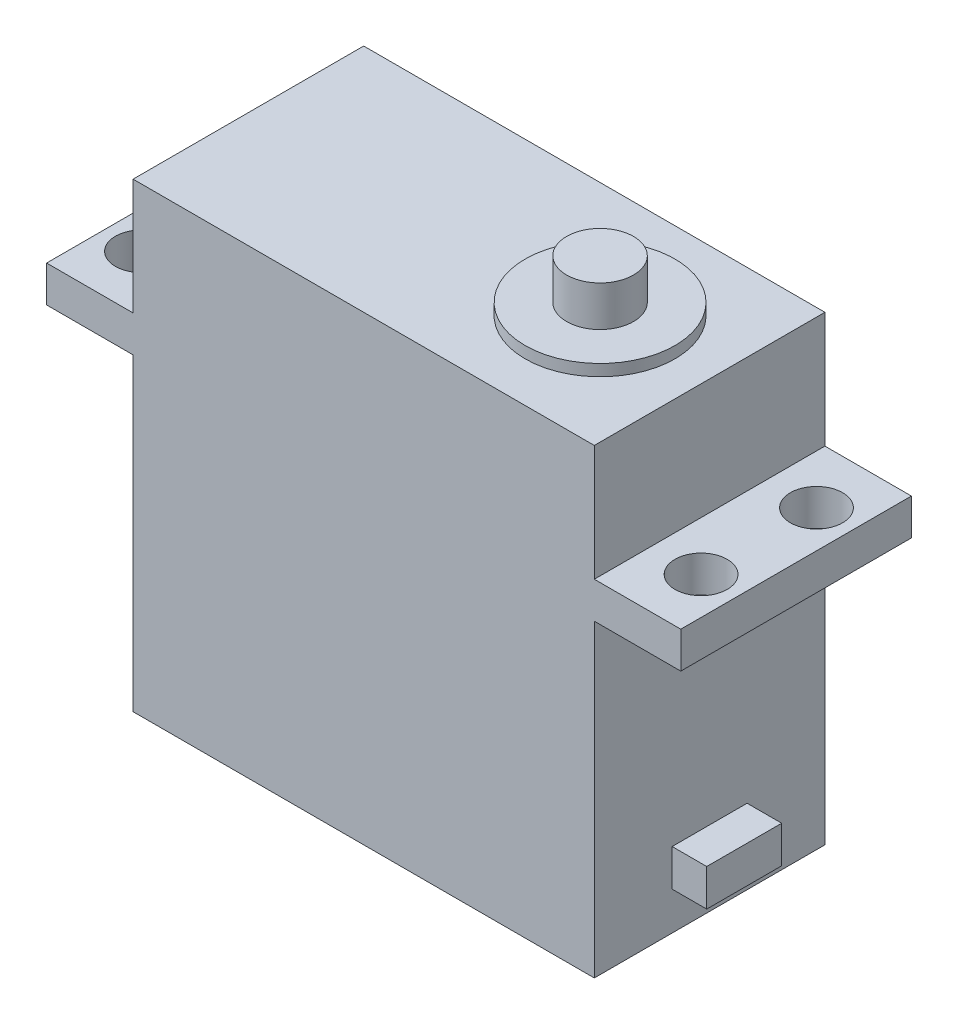
ISO-10303-21;
HEADER;
FILE_DESCRIPTION(('STEP AP214'),'2;1');
FILE_NAME('part.step','',(''),(''),'','','');
FILE_SCHEMA(('AUTOMOTIVE_DESIGN { 1 0 10303 214 1 1 1 1 }'));
ENDSEC;
DATA;
#1=APPLICATION_CONTEXT('core data for automotive mechanical design processes');
#2=APPLICATION_PROTOCOL_DEFINITION('international standard','automotive_design',2000,#1);
#3=PRODUCT_CONTEXT('',#1,'mechanical');
#4=PRODUCT('Part','Part','',(#3));
#5=PRODUCT_RELATED_PRODUCT_CATEGORY('part','',(#4));
#6=PRODUCT_DEFINITION_FORMATION('','',#4);
#7=PRODUCT_DEFINITION_CONTEXT('part definition',#1,'design');
#8=PRODUCT_DEFINITION('design','',#6,#7);
#9=PRODUCT_DEFINITION_SHAPE('','',#8);
#10=(LENGTH_UNIT() NAMED_UNIT(*) SI_UNIT(.MILLI.,.METRE.));
#11=(NAMED_UNIT(*) PLANE_ANGLE_UNIT() SI_UNIT($,.RADIAN.));
#12=(NAMED_UNIT(*) SI_UNIT($,.STERADIAN.) SOLID_ANGLE_UNIT());
#13=UNCERTAINTY_MEASURE_WITH_UNIT(LENGTH_MEASURE(1.E-05),#10,'distance_accuracy_value','');
#14=(GEOMETRIC_REPRESENTATION_CONTEXT(3) GLOBAL_UNCERTAINTY_ASSIGNED_CONTEXT((#13)) GLOBAL_UNIT_ASSIGNED_CONTEXT((#10,
#11,#12)) REPRESENTATION_CONTEXT('',''));
#15=CARTESIAN_POINT('',(0.,0.,0.));
#16=DIRECTION('',(0.,0.,1.));
#17=DIRECTION('',(1.,0.,0.));
#18=AXIS2_PLACEMENT_3D('',#15,#16,#17);
#19=CARTESIAN_POINT('',(20.,40.,-10.));
#20=DIRECTION('',(-1.,0.,0.));
#21=DIRECTION('',(0.,0.,1.));
#22=AXIS2_PLACEMENT_3D('',#19,#20,#21);
#23=PLANE('',#22);
#24=DIRECTION('',(0.,0.,-1.));
#25=VECTOR('',#24,1.);
#26=CARTESIAN_POINT('',(20.,26.8,-10.));
#27=LINE('',#26,#25);
#28=CARTESIAN_POINT('',(20.,26.8,10.));
#29=VERTEX_POINT('',#28);
#30=CARTESIAN_POINT('',(20.,26.8,-10.));
#31=VERTEX_POINT('',#30);
#32=EDGE_CURVE('E248',#29,#31,#27,.T.);
#33=ORIENTED_EDGE('',*,*,#32,.F.);
#34=DIRECTION('',(0.,-1.,0.));
#35=VECTOR('',#34,1.);
#36=CARTESIAN_POINT('',(20.,40.,10.));
#37=LINE('',#36,#35);
#38=CARTESIAN_POINT('',(20.,0.,10.));
#39=VERTEX_POINT('',#38);
#40=EDGE_CURVE('E266',#29,#39,#37,.T.);
#41=ORIENTED_EDGE('',*,*,#40,.T.);
#42=DIRECTION('',(0.,0.,-1.));
#43=VECTOR('',#42,1.);
#44=CARTESIAN_POINT('',(20.,0.,-10.));
#45=LINE('',#44,#43);
#46=CARTESIAN_POINT('',(20.,0.,-10.));
#47=VERTEX_POINT('',#46);
#48=EDGE_CURVE('E255',#39,#47,#45,.T.);
#49=ORIENTED_EDGE('',*,*,#48,.T.);
#50=DIRECTION('',(0.,-1.,0.));
#51=VECTOR('',#50,1.);
#52=CARTESIAN_POINT('',(20.,40.,-10.));
#53=LINE('',#52,#51);
#54=EDGE_CURVE('E286',#31,#47,#53,.T.);
#55=ORIENTED_EDGE('',*,*,#54,.F.);
#56=EDGE_LOOP('',(#33,#41,#49,#55));
#57=FACE_BOUND('',#56,.T.);
#58=DIRECTION('',(0.,1.,0.));
#59=VECTOR('',#58,1.);
#60=CARTESIAN_POINT('',(20.,6.5,-3.25));
#61=LINE('',#60,#59);
#62=CARTESIAN_POINT('',(20.,3.3,-3.25));
#63=VERTEX_POINT('',#62);
#64=CARTESIAN_POINT('',(20.,6.5,-3.25));
#65=VERTEX_POINT('',#64);
#66=EDGE_CURVE('E177',#63,#65,#61,.T.);
#67=ORIENTED_EDGE('',*,*,#66,.F.);
#68=DIRECTION('',(0.,0.,-1.));
#69=VECTOR('',#68,1.);
#70=CARTESIAN_POINT('',(20.,3.3,3.25));
#71=LINE('',#70,#69);
#72=CARTESIAN_POINT('',(20.,3.3,3.25));
#73=VERTEX_POINT('',#72);
#74=EDGE_CURVE('E174',#73,#63,#71,.T.);
#75=ORIENTED_EDGE('',*,*,#74,.F.);
#76=DIRECTION('',(0.,-1.,0.));
#77=VECTOR('',#76,1.);
#78=CARTESIAN_POINT('',(20.,6.5,3.25));
#79=LINE('',#78,#77);
#80=CARTESIAN_POINT('',(20.,6.5,3.25));
#81=VERTEX_POINT('',#80);
#82=EDGE_CURVE('E64',#81,#73,#79,.T.);
#83=ORIENTED_EDGE('',*,*,#82,.F.);
#84=DIRECTION('',(0.,0.,1.));
#85=VECTOR('',#84,1.);
#86=CARTESIAN_POINT('',(20.,6.5,3.25));
#87=LINE('',#86,#85);
#88=EDGE_CURVE('E59',#65,#81,#87,.T.);
#89=ORIENTED_EDGE('',*,*,#88,.F.);
#90=EDGE_LOOP('',(#67,#75,#83,#89));
#91=FACE_BOUND('',#90,.T.);
#92=ADVANCED_FACE('F42',(#57,#91),#23,.F.);
#93=CARTESIAN_POINT('',(-20.,40.,-10.));
#94=DIRECTION('',(1.,0.,0.));
#95=DIRECTION('',(0.,0.,-1.));
#96=AXIS2_PLACEMENT_3D('',#93,#94,#95);
#97=PLANE('',#96);
#98=DIRECTION('',(0.,0.,1.));
#99=VECTOR('',#98,1.);
#100=CARTESIAN_POINT('',(-20.,26.8,-10.));
#101=LINE('',#100,#99);
#102=CARTESIAN_POINT('',(-20.,26.8,-10.));
#103=VERTEX_POINT('',#102);
#104=CARTESIAN_POINT('',(-20.,26.8,10.));
#105=VERTEX_POINT('',#104);
#106=EDGE_CURVE('E245',#103,#105,#101,.T.);
#107=ORIENTED_EDGE('',*,*,#106,.F.);
#108=DIRECTION('',(0.,-1.,0.));
#109=VECTOR('',#108,1.);
#110=CARTESIAN_POINT('',(-20.,40.,-10.));
#111=LINE('',#110,#109);
#112=CARTESIAN_POINT('',(-20.,0.,-10.));
#113=VERTEX_POINT('',#112);
#114=EDGE_CURVE('E283',#103,#113,#111,.T.);
#115=ORIENTED_EDGE('',*,*,#114,.T.);
#116=DIRECTION('',(0.,0.,1.));
#117=VECTOR('',#116,1.);
#118=CARTESIAN_POINT('',(-20.,0.,-10.));
#119=LINE('',#118,#117);
#120=CARTESIAN_POINT('',(-20.,0.,10.));
#121=VERTEX_POINT('',#120);
#122=EDGE_CURVE('E272',#113,#121,#119,.T.);
#123=ORIENTED_EDGE('',*,*,#122,.T.);
#124=DIRECTION('',(0.,-1.,0.));
#125=VECTOR('',#124,1.);
#126=CARTESIAN_POINT('',(-20.,40.,10.));
#127=LINE('',#126,#125);
#128=EDGE_CURVE('E279',#105,#121,#127,.T.);
#129=ORIENTED_EDGE('',*,*,#128,.F.);
#130=EDGE_LOOP('',(#107,#115,#123,#129));
#131=FACE_BOUND('',#130,.T.);
#132=ADVANCED_FACE('F316',(#131),#97,.F.);
#133=CARTESIAN_POINT('',(20.,40.,10.));
#134=VERTEX_POINT('',#133);
#135=CARTESIAN_POINT('',(20.,29.95,10.));
#136=VERTEX_POINT('',#135);
#137=EDGE_CURVE('E277',#134,#136,#37,.T.);
#138=ORIENTED_EDGE('',*,*,#137,.T.);
#139=DIRECTION('',(0.,0.,-1.));
#140=VECTOR('',#139,1.);
#141=CARTESIAN_POINT('',(20.,29.95,-10.));
#142=LINE('',#141,#140);
#143=CARTESIAN_POINT('',(20.,29.95,-10.));
#144=VERTEX_POINT('',#143);
#145=EDGE_CURVE('E253',#136,#144,#142,.T.);
#146=ORIENTED_EDGE('',*,*,#145,.T.);
#147=CARTESIAN_POINT('',(20.,40.,-10.));
#148=VERTEX_POINT('',#147);
#149=EDGE_CURVE('E51',#148,#144,#53,.T.);
#150=ORIENTED_EDGE('',*,*,#149,.F.);
#151=DIRECTION('',(0.,0.,-1.));
#152=VECTOR('',#151,1.);
#153=CARTESIAN_POINT('',(20.,40.,-10.));
#154=LINE('',#153,#152);
#155=EDGE_CURVE('E256',#134,#148,#154,.T.);
#156=ORIENTED_EDGE('',*,*,#155,.F.);
#157=EDGE_LOOP('',(#138,#146,#150,#156));
#158=FACE_BOUND('',#157,.T.);
#159=ADVANCED_FACE('F44',(#158),#23,.F.);
#160=CARTESIAN_POINT('',(-20.,40.,-10.));
#161=DIRECTION('',(0.,0.,1.));
#162=DIRECTION('',(1.,0.,0.));
#163=AXIS2_PLACEMENT_3D('',#160,#161,#162);
#164=PLANE('',#163);
#165=ORIENTED_EDGE('',*,*,#149,.T.);
#166=DIRECTION('',(-1.,0.,0.));
#167=VECTOR('',#166,1.);
#168=CARTESIAN_POINT('',(-27.5,29.95,-10.));
#169=LINE('',#168,#167);
#170=CARTESIAN_POINT('',(27.5,29.95,-10.));
#171=VERTEX_POINT('',#170);
#172=EDGE_CURVE('E213',#171,#144,#169,.T.);
#173=ORIENTED_EDGE('',*,*,#172,.F.);
#174=DIRECTION('',(0.,-1.,0.));
#175=VECTOR('',#174,1.);
#176=CARTESIAN_POINT('',(27.5,29.95,-10.));
#177=LINE('',#176,#175);
#178=CARTESIAN_POINT('',(27.5,26.8,-10.));
#179=VERTEX_POINT('',#178);
#180=EDGE_CURVE('E242',#171,#179,#177,.T.);
#181=ORIENTED_EDGE('',*,*,#180,.T.);
#182=DIRECTION('',(-1.,0.,0.));
#183=VECTOR('',#182,1.);
#184=CARTESIAN_POINT('',(-27.5,26.8,-10.));
#185=LINE('',#184,#183);
#186=EDGE_CURVE('E226',#179,#31,#185,.T.);
#187=ORIENTED_EDGE('',*,*,#186,.T.);
#188=ORIENTED_EDGE('',*,*,#54,.T.);
#189=DIRECTION('',(-1.,0.,0.));
#190=VECTOR('',#189,1.);
#191=CARTESIAN_POINT('',(-20.,0.,-10.));
#192=LINE('',#191,#190);
#193=EDGE_CURVE('E269',#47,#113,#192,.T.);
#194=ORIENTED_EDGE('',*,*,#193,.T.);
#195=ORIENTED_EDGE('',*,*,#114,.F.);
#196=CARTESIAN_POINT('',(-27.5,26.8,-10.));
#197=VERTEX_POINT('',#196);
#198=EDGE_CURVE('E225',#103,#197,#185,.T.);
#199=ORIENTED_EDGE('',*,*,#198,.T.);
#200=DIRECTION('',(0.,-1.,0.));
#201=VECTOR('',#200,1.);
#202=CARTESIAN_POINT('',(-27.5,29.95,-10.));
#203=LINE('',#202,#201);
#204=CARTESIAN_POINT('',(-27.5,29.95,-10.));
#205=VERTEX_POINT('',#204);
#206=EDGE_CURVE('E239',#205,#197,#203,.T.);
#207=ORIENTED_EDGE('',*,*,#206,.F.);
#208=CARTESIAN_POINT('',(-20.,29.95,-10.));
#209=VERTEX_POINT('',#208);
#210=EDGE_CURVE('E211',#209,#205,#169,.T.);
#211=ORIENTED_EDGE('',*,*,#210,.F.);
#212=CARTESIAN_POINT('',(-20.,40.,-10.));
#213=VERTEX_POINT('',#212);
#214=EDGE_CURVE('E284',#213,#209,#111,.T.);
#215=ORIENTED_EDGE('',*,*,#214,.F.);
#216=DIRECTION('',(-1.,0.,0.));
#217=VECTOR('',#216,1.);
#218=CARTESIAN_POINT('',(-20.,40.,-10.));
#219=LINE('',#218,#217);
#220=EDGE_CURVE('E259',#148,#213,#219,.T.);
#221=ORIENTED_EDGE('',*,*,#220,.F.);
#222=EDGE_LOOP('',(#165,#173,#181,#187,#188,#194,#195,#199,#207,#211,#215,#221));
#223=FACE_BOUND('',#222,.T.);
#224=ADVANCED_FACE('F327',(#223),#164,.F.);
#225=ORIENTED_EDGE('',*,*,#214,.T.);
#226=DIRECTION('',(0.,0.,1.));
#227=VECTOR('',#226,1.);
#228=CARTESIAN_POINT('',(-20.,29.95,-10.));
#229=LINE('',#228,#227);
#230=CARTESIAN_POINT('',(-20.,29.95,10.));
#231=VERTEX_POINT('',#230);
#232=EDGE_CURVE('E251',#209,#231,#229,.T.);
#233=ORIENTED_EDGE('',*,*,#232,.T.);
#234=CARTESIAN_POINT('',(-20.,40.,10.));
#235=VERTEX_POINT('',#234);
#236=EDGE_CURVE('E280',#235,#231,#127,.T.);
#237=ORIENTED_EDGE('',*,*,#236,.F.);
#238=DIRECTION('',(0.,0.,1.));
#239=VECTOR('',#238,1.);
#240=CARTESIAN_POINT('',(-20.,40.,-10.));
#241=LINE('',#240,#239);
#242=EDGE_CURVE('E262',#213,#235,#241,.T.);
#243=ORIENTED_EDGE('',*,*,#242,.F.);
#244=EDGE_LOOP('',(#225,#233,#237,#243));
#245=FACE_BOUND('',#244,.T.);
#246=ADVANCED_FACE('F325',(#245),#97,.F.);
#247=CARTESIAN_POINT('',(-20.,40.,10.));
#248=DIRECTION('',(0.,0.,-1.));
#249=DIRECTION('',(-1.,0.,0.));
#250=AXIS2_PLACEMENT_3D('',#247,#248,#249);
#251=PLANE('',#250);
#252=ORIENTED_EDGE('',*,*,#236,.T.);
#253=DIRECTION('',(1.,0.,0.));
#254=VECTOR('',#253,1.);
#255=CARTESIAN_POINT('',(-27.5,29.95,10.));
#256=LINE('',#255,#254);
#257=CARTESIAN_POINT('',(-27.5,29.95,10.));
#258=VERTEX_POINT('',#257);
#259=EDGE_CURVE('E219',#258,#231,#256,.T.);
#260=ORIENTED_EDGE('',*,*,#259,.F.);
#261=DIRECTION('',(0.,-1.,0.));
#262=VECTOR('',#261,1.);
#263=CARTESIAN_POINT('',(-27.5,29.95,10.));
#264=LINE('',#263,#262);
#265=CARTESIAN_POINT('',(-27.5,26.8,10.));
#266=VERTEX_POINT('',#265);
#267=EDGE_CURVE('E236',#258,#266,#264,.T.);
#268=ORIENTED_EDGE('',*,*,#267,.T.);
#269=DIRECTION('',(1.,0.,0.));
#270=VECTOR('',#269,1.);
#271=CARTESIAN_POINT('',(-27.5,26.8,10.));
#272=LINE('',#271,#270);
#273=EDGE_CURVE('E212',#266,#105,#272,.T.);
#274=ORIENTED_EDGE('',*,*,#273,.T.);
#275=ORIENTED_EDGE('',*,*,#128,.T.);
#276=DIRECTION('',(1.,0.,0.));
#277=VECTOR('',#276,1.);
#278=CARTESIAN_POINT('',(-20.,0.,10.));
#279=LINE('',#278,#277);
#280=EDGE_CURVE('E260',#121,#39,#279,.T.);
#281=ORIENTED_EDGE('',*,*,#280,.T.);
#282=ORIENTED_EDGE('',*,*,#40,.F.);
#283=CARTESIAN_POINT('',(27.5,26.8,10.));
#284=VERTEX_POINT('',#283);
#285=EDGE_CURVE('E231',#29,#284,#272,.T.);
#286=ORIENTED_EDGE('',*,*,#285,.T.);
#287=DIRECTION('',(0.,-1.,0.));
#288=VECTOR('',#287,1.);
#289=CARTESIAN_POINT('',(27.5,29.95,10.));
#290=LINE('',#289,#288);
#291=CARTESIAN_POINT('',(27.5,29.95,10.));
#292=VERTEX_POINT('',#291);
#293=EDGE_CURVE('E222',#292,#284,#290,.T.);
#294=ORIENTED_EDGE('',*,*,#293,.F.);
#295=EDGE_CURVE('E218',#136,#292,#256,.T.);
#296=ORIENTED_EDGE('',*,*,#295,.F.);
#297=ORIENTED_EDGE('',*,*,#137,.F.);
#298=DIRECTION('',(1.,0.,0.));
#299=VECTOR('',#298,1.);
#300=CARTESIAN_POINT('',(-20.,40.,10.));
#301=LINE('',#300,#299);
#302=EDGE_CURVE('E264',#235,#134,#301,.T.);
#303=ORIENTED_EDGE('',*,*,#302,.F.);
#304=EDGE_LOOP('',(#252,#260,#268,#274,#275,#281,#282,#286,#294,#296,#297,#303));
#305=FACE_BOUND('',#304,.T.);
#306=ADVANCED_FACE('F343',(#305),#251,.F.);
#307=CARTESIAN_POINT('',(0.,40.,0.));
#308=DIRECTION('',(0.,1.,0.));
#309=DIRECTION('',(0.,0.,1.));
#310=AXIS2_PLACEMENT_3D('',#307,#308,#309);
#311=PLANE('',#310);
#312=CARTESIAN_POINT('',(10.5,40.,0.));
#313=DIRECTION('',(0.,1.,0.));
#314=DIRECTION('',(0.,0.,1.));
#315=AXIS2_PLACEMENT_3D('',#312,#313,#314);
#316=CIRCLE('',#315,6.5);
#317=CARTESIAN_POINT('',(10.5,40.,6.5));
#318=VERTEX_POINT('',#317);
#319=EDGE_CURVE('E181',#318,#318,#316,.T.);
#320=ORIENTED_EDGE('',*,*,#319,.F.);
#321=EDGE_LOOP('',(#320));
#322=FACE_BOUND('',#321,.T.);
#323=ORIENTED_EDGE('',*,*,#155,.T.);
#324=ORIENTED_EDGE('',*,*,#220,.T.);
#325=ORIENTED_EDGE('',*,*,#242,.T.);
#326=ORIENTED_EDGE('',*,*,#302,.T.);
#327=EDGE_LOOP('',(#323,#324,#325,#326));
#328=FACE_BOUND('',#327,.T.);
#329=ADVANCED_FACE('F355',(#322,#328),#311,.T.);
#330=CARTESIAN_POINT('',(0.,0.,0.));
#331=DIRECTION('',(0.,1.,0.));
#332=DIRECTION('',(0.,0.,1.));
#333=AXIS2_PLACEMENT_3D('',#330,#331,#332);
#334=PLANE('',#333);
#335=ORIENTED_EDGE('',*,*,#48,.F.);
#336=ORIENTED_EDGE('',*,*,#280,.F.);
#337=ORIENTED_EDGE('',*,*,#122,.F.);
#338=ORIENTED_EDGE('',*,*,#193,.F.);
#339=EDGE_LOOP('',(#335,#336,#337,#338));
#340=FACE_BOUND('',#339,.T.);
#341=ADVANCED_FACE('F376',(#340),#334,.F.);
#342=CARTESIAN_POINT('',(-27.5,29.95,-10.));
#343=DIRECTION('',(1.,0.,0.));
#344=DIRECTION('',(0.,0.,-1.));
#345=AXIS2_PLACEMENT_3D('',#342,#343,#344);
#346=PLANE('',#345);
#347=DIRECTION('',(0.,0.,1.));
#348=VECTOR('',#347,1.);
#349=CARTESIAN_POINT('',(-27.5,26.8,-10.));
#350=LINE('',#349,#348);
#351=EDGE_CURVE('E229',#197,#266,#350,.T.);
#352=ORIENTED_EDGE('',*,*,#351,.T.);
#353=ORIENTED_EDGE('',*,*,#267,.F.);
#354=DIRECTION('',(0.,0.,1.));
#355=VECTOR('',#354,1.);
#356=CARTESIAN_POINT('',(-27.5,29.95,-10.));
#357=LINE('',#356,#355);
#358=EDGE_CURVE('E216',#205,#258,#357,.T.);
#359=ORIENTED_EDGE('',*,*,#358,.F.);
#360=ORIENTED_EDGE('',*,*,#206,.T.);
#361=EDGE_LOOP('',(#352,#353,#359,#360));
#362=FACE_BOUND('',#361,.T.);
#363=ADVANCED_FACE('F366',(#362),#346,.F.);
#364=CARTESIAN_POINT('',(0.,29.95,0.));
#365=DIRECTION('',(0.,1.,0.));
#366=DIRECTION('',(0.,0.,1.));
#367=AXIS2_PLACEMENT_3D('',#364,#365,#366);
#368=PLANE('',#367);
#369=CARTESIAN_POINT('',(-24.265,29.95,5.005));
#370=DIRECTION('',(0.,1.,0.));
#371=DIRECTION('',(0.,0.,1.));
#372=AXIS2_PLACEMENT_3D('',#369,#370,#371);
#373=CIRCLE('',#372,2.265);
#374=CARTESIAN_POINT('',(-24.265,29.95,7.27));
#375=VERTEX_POINT('',#374);
#376=EDGE_CURVE('E204',#375,#375,#373,.T.);
#377=ORIENTED_EDGE('',*,*,#376,.F.);
#378=EDGE_LOOP('',(#377));
#379=FACE_BOUND('',#378,.T.);
#380=CARTESIAN_POINT('',(-24.265,29.95,-5.005));
#381=DIRECTION('',(0.,1.,0.));
#382=DIRECTION('',(0.,0.,1.));
#383=AXIS2_PLACEMENT_3D('',#380,#381,#382);
#384=CIRCLE('',#383,2.265);
#385=CARTESIAN_POINT('',(-24.265,29.95,-2.74));
#386=VERTEX_POINT('',#385);
#387=EDGE_CURVE('E201',#386,#386,#384,.T.);
#388=ORIENTED_EDGE('',*,*,#387,.F.);
#389=EDGE_LOOP('',(#388));
#390=FACE_BOUND('',#389,.T.);
#391=ORIENTED_EDGE('',*,*,#232,.F.);
#392=ORIENTED_EDGE('',*,*,#210,.T.);
#393=ORIENTED_EDGE('',*,*,#358,.T.);
#394=ORIENTED_EDGE('',*,*,#259,.T.);
#395=EDGE_LOOP('',(#391,#392,#393,#394));
#396=FACE_BOUND('',#395,.T.);
#397=ADVANCED_FACE('F361',(#379,#390,#396),#368,.T.);
#398=CARTESIAN_POINT('',(0.,26.8,0.));
#399=DIRECTION('',(0.,1.,0.));
#400=DIRECTION('',(0.,0.,1.));
#401=AXIS2_PLACEMENT_3D('',#398,#399,#400);
#402=PLANE('',#401);
#403=CARTESIAN_POINT('',(-24.265,26.8,5.005));
#404=DIRECTION('',(0.,1.,0.));
#405=DIRECTION('',(0.,0.,1.));
#406=AXIS2_PLACEMENT_3D('',#403,#404,#405);
#407=CIRCLE('',#406,2.265);
#408=CARTESIAN_POINT('',(-24.265,26.8,7.27));
#409=VERTEX_POINT('',#408);
#410=EDGE_CURVE('E46',#409,#409,#407,.T.);
#411=ORIENTED_EDGE('',*,*,#410,.T.);
#412=EDGE_LOOP('',(#411));
#413=FACE_BOUND('',#412,.T.);
#414=CARTESIAN_POINT('',(-24.265,26.8,-5.005));
#415=DIRECTION('',(0.,1.,0.));
#416=DIRECTION('',(0.,0.,1.));
#417=AXIS2_PLACEMENT_3D('',#414,#415,#416);
#418=CIRCLE('',#417,2.265);
#419=CARTESIAN_POINT('',(-24.265,26.8,-2.74));
#420=VERTEX_POINT('',#419);
#421=EDGE_CURVE('E200',#420,#420,#418,.T.);
#422=ORIENTED_EDGE('',*,*,#421,.T.);
#423=EDGE_LOOP('',(#422));
#424=FACE_BOUND('',#423,.T.);
#425=ORIENTED_EDGE('',*,*,#198,.F.);
#426=ORIENTED_EDGE('',*,*,#106,.T.);
#427=ORIENTED_EDGE('',*,*,#273,.F.);
#428=ORIENTED_EDGE('',*,*,#351,.F.);
#429=EDGE_LOOP('',(#425,#426,#427,#428));
#430=FACE_BOUND('',#429,.T.);
#431=ADVANCED_FACE('F295',(#413,#424,#430),#402,.F.);
#432=CARTESIAN_POINT('',(24.265,29.95,-5.005));
#433=DIRECTION('',(0.,1.,0.));
#434=DIRECTION('',(0.,0.,1.));
#435=AXIS2_PLACEMENT_3D('',#432,#433,#434);
#436=CIRCLE('',#435,2.265);
#437=CARTESIAN_POINT('',(24.265,29.95,-2.74));
#438=VERTEX_POINT('',#437);
#439=EDGE_CURVE('E197',#438,#438,#436,.T.);
#440=ORIENTED_EDGE('',*,*,#439,.F.);
#441=EDGE_LOOP('',(#440));
#442=FACE_BOUND('',#441,.T.);
#443=CARTESIAN_POINT('',(24.265,29.95,5.005));
#444=DIRECTION('',(0.,1.,0.));
#445=DIRECTION('',(0.,0.,1.));
#446=AXIS2_PLACEMENT_3D('',#443,#444,#445);
#447=CIRCLE('',#446,2.265);
#448=CARTESIAN_POINT('',(24.265,29.95,7.27));
#449=VERTEX_POINT('',#448);
#450=EDGE_CURVE('E193',#449,#449,#447,.T.);
#451=ORIENTED_EDGE('',*,*,#450,.F.);
#452=EDGE_LOOP('',(#451));
#453=FACE_BOUND('',#452,.T.);
#454=ORIENTED_EDGE('',*,*,#145,.F.);
#455=ORIENTED_EDGE('',*,*,#295,.T.);
#456=DIRECTION('',(0.,0.,-1.));
#457=VECTOR('',#456,1.);
#458=CARTESIAN_POINT('',(27.5,29.95,-10.));
#459=LINE('',#458,#457);
#460=EDGE_CURVE('E208',#292,#171,#459,.T.);
#461=ORIENTED_EDGE('',*,*,#460,.T.);
#462=ORIENTED_EDGE('',*,*,#172,.T.);
#463=EDGE_LOOP('',(#454,#455,#461,#462));
#464=FACE_BOUND('',#463,.T.);
#465=ADVANCED_FACE('F341',(#442,#453,#464),#368,.T.);
#466=CARTESIAN_POINT('',(24.265,26.8,-5.005));
#467=DIRECTION('',(0.,1.,0.));
#468=DIRECTION('',(0.,0.,1.));
#469=AXIS2_PLACEMENT_3D('',#466,#467,#468);
#470=CIRCLE('',#469,2.265);
#471=CARTESIAN_POINT('',(24.265,26.8,-2.74));
#472=VERTEX_POINT('',#471);
#473=EDGE_CURVE('E196',#472,#472,#470,.T.);
#474=ORIENTED_EDGE('',*,*,#473,.T.);
#475=EDGE_LOOP('',(#474));
#476=FACE_BOUND('',#475,.T.);
#477=CARTESIAN_POINT('',(24.265,26.8,5.005));
#478=DIRECTION('',(0.,1.,0.));
#479=DIRECTION('',(0.,0.,1.));
#480=AXIS2_PLACEMENT_3D('',#477,#478,#479);
#481=CIRCLE('',#480,2.265);
#482=CARTESIAN_POINT('',(24.265,26.8,7.27));
#483=VERTEX_POINT('',#482);
#484=EDGE_CURVE('E190',#483,#483,#481,.T.);
#485=ORIENTED_EDGE('',*,*,#484,.T.);
#486=EDGE_LOOP('',(#485));
#487=FACE_BOUND('',#486,.T.);
#488=ORIENTED_EDGE('',*,*,#285,.F.);
#489=ORIENTED_EDGE('',*,*,#32,.T.);
#490=ORIENTED_EDGE('',*,*,#186,.F.);
#491=DIRECTION('',(0.,0.,-1.));
#492=VECTOR('',#491,1.);
#493=CARTESIAN_POINT('',(27.5,26.8,-10.));
#494=LINE('',#493,#492);
#495=EDGE_CURVE('E207',#284,#179,#494,.T.);
#496=ORIENTED_EDGE('',*,*,#495,.F.);
#497=EDGE_LOOP('',(#488,#489,#490,#496));
#498=FACE_BOUND('',#497,.T.);
#499=ADVANCED_FACE('F378',(#476,#487,#498),#402,.F.);
#500=CARTESIAN_POINT('',(27.5,29.95,-10.));
#501=DIRECTION('',(-1.,0.,0.));
#502=DIRECTION('',(0.,0.,1.));
#503=AXIS2_PLACEMENT_3D('',#500,#501,#502);
#504=PLANE('',#503);
#505=ORIENTED_EDGE('',*,*,#495,.T.);
#506=ORIENTED_EDGE('',*,*,#180,.F.);
#507=ORIENTED_EDGE('',*,*,#460,.F.);
#508=ORIENTED_EDGE('',*,*,#293,.T.);
#509=EDGE_LOOP('',(#505,#506,#507,#508));
#510=FACE_BOUND('',#509,.T.);
#511=ADVANCED_FACE('F350',(#510),#504,.F.);
#512=CARTESIAN_POINT('',(24.265,0.,5.005));
#513=DIRECTION('',(0.,1.,0.));
#514=DIRECTION('',(0.,0.,1.));
#515=AXIS2_PLACEMENT_3D('',#512,#513,#514);
#516=CYLINDRICAL_SURFACE('',#515,2.265);
#517=ORIENTED_EDGE('',*,*,#450,.T.);
#518=EDGE_LOOP('',(#517));
#519=FACE_BOUND('',#518,.T.);
#520=ORIENTED_EDGE('',*,*,#484,.F.);
#521=EDGE_LOOP('',(#520));
#522=FACE_BOUND('',#521,.T.);
#523=ADVANCED_FACE('F311',(#519,#522),#516,.F.);
#524=CARTESIAN_POINT('',(24.265,0.,-5.005));
#525=DIRECTION('',(0.,1.,0.));
#526=DIRECTION('',(0.,0.,1.));
#527=AXIS2_PLACEMENT_3D('',#524,#525,#526);
#528=CYLINDRICAL_SURFACE('',#527,2.265);
#529=ORIENTED_EDGE('',*,*,#439,.T.);
#530=EDGE_LOOP('',(#529));
#531=FACE_BOUND('',#530,.T.);
#532=ORIENTED_EDGE('',*,*,#473,.F.);
#533=EDGE_LOOP('',(#532));
#534=FACE_BOUND('',#533,.T.);
#535=ADVANCED_FACE('F301',(#531,#534),#528,.F.);
#536=CARTESIAN_POINT('',(-24.265,0.,-5.005));
#537=DIRECTION('',(0.,1.,0.));
#538=DIRECTION('',(0.,0.,1.));
#539=AXIS2_PLACEMENT_3D('',#536,#537,#538);
#540=CYLINDRICAL_SURFACE('',#539,2.265);
#541=ORIENTED_EDGE('',*,*,#387,.T.);
#542=EDGE_LOOP('',(#541));
#543=FACE_BOUND('',#542,.T.);
#544=ORIENTED_EDGE('',*,*,#421,.F.);
#545=EDGE_LOOP('',(#544));
#546=FACE_BOUND('',#545,.T.);
#547=ADVANCED_FACE('F298',(#543,#546),#540,.F.);
#548=CARTESIAN_POINT('',(-24.265,0.,5.005));
#549=DIRECTION('',(0.,1.,0.));
#550=DIRECTION('',(0.,0.,1.));
#551=AXIS2_PLACEMENT_3D('',#548,#549,#550);
#552=CYLINDRICAL_SURFACE('',#551,2.265);
#553=ORIENTED_EDGE('',*,*,#376,.T.);
#554=EDGE_LOOP('',(#553));
#555=FACE_BOUND('',#554,.T.);
#556=ORIENTED_EDGE('',*,*,#410,.F.);
#557=EDGE_LOOP('',(#556));
#558=FACE_BOUND('',#557,.T.);
#559=ADVANCED_FACE('F300',(#555,#558),#552,.F.);
#560=CARTESIAN_POINT('',(10.5,41.,0.));
#561=DIRECTION('',(0.,-1.,0.));
#562=DIRECTION('',(0.,0.,-1.));
#563=AXIS2_PLACEMENT_3D('',#560,#561,#562);
#564=CYLINDRICAL_SURFACE('',#563,6.5);
#565=CARTESIAN_POINT('',(10.5,41.,0.));
#566=DIRECTION('',(0.,1.,0.));
#567=DIRECTION('',(0.,0.,1.));
#568=AXIS2_PLACEMENT_3D('',#565,#566,#567);
#569=CIRCLE('',#568,6.5);
#570=CARTESIAN_POINT('',(10.5,41.,6.5));
#571=VERTEX_POINT('',#570);
#572=EDGE_CURVE('E187',#571,#571,#569,.T.);
#573=ORIENTED_EDGE('',*,*,#572,.F.);
#574=EDGE_LOOP('',(#573));
#575=FACE_BOUND('',#574,.T.);
#576=ORIENTED_EDGE('',*,*,#319,.T.);
#577=EDGE_LOOP('',(#576));
#578=FACE_BOUND('',#577,.T.);
#579=ADVANCED_FACE('F308',(#575,#578),#564,.T.);
#580=CARTESIAN_POINT('',(10.5,41.,0.));
#581=DIRECTION('',(0.,1.,0.));
#582=DIRECTION('',(0.,0.,1.));
#583=AXIS2_PLACEMENT_3D('',#580,#581,#582);
#584=PLANE('',#583);
#585=CARTESIAN_POINT('',(10.5,41.,0.));
#586=DIRECTION('',(0.,1.,0.));
#587=DIRECTION('',(0.,0.,1.));
#588=AXIS2_PLACEMENT_3D('',#585,#586,#587);
#589=CIRCLE('',#588,2.9);
#590=CARTESIAN_POINT('',(10.5,41.,2.9));
#591=VERTEX_POINT('',#590);
#592=EDGE_CURVE('E11',#591,#591,#589,.T.);
#593=ORIENTED_EDGE('',*,*,#592,.F.);
#594=EDGE_LOOP('',(#593));
#595=FACE_BOUND('',#594,.T.);
#596=ORIENTED_EDGE('',*,*,#572,.T.);
#597=EDGE_LOOP('',(#596));
#598=FACE_BOUND('',#597,.T.);
#599=ADVANCED_FACE('F495',(#595,#598),#584,.T.);
#600=CARTESIAN_POINT('',(10.5,44.5,0.));
#601=DIRECTION('',(0.,-1.,0.));
#602=DIRECTION('',(0.,0.,-1.));
#603=AXIS2_PLACEMENT_3D('',#600,#601,#602);
#604=CYLINDRICAL_SURFACE('',#603,2.9);
#605=CARTESIAN_POINT('',(10.5,44.5,0.));
#606=DIRECTION('',(0.,1.,0.));
#607=DIRECTION('',(0.,0.,1.));
#608=AXIS2_PLACEMENT_3D('',#605,#606,#607);
#609=CIRCLE('',#608,2.9);
#610=CARTESIAN_POINT('',(10.5,44.5,2.9));
#611=VERTEX_POINT('',#610);
#612=EDGE_CURVE('E178',#611,#611,#609,.T.);
#613=ORIENTED_EDGE('',*,*,#612,.F.);
#614=EDGE_LOOP('',(#613));
#615=FACE_BOUND('',#614,.T.);
#616=ORIENTED_EDGE('',*,*,#592,.T.);
#617=EDGE_LOOP('',(#616));
#618=FACE_BOUND('',#617,.T.);
#619=ADVANCED_FACE('F505',(#615,#618),#604,.T.);
#620=CARTESIAN_POINT('',(10.5,44.5,0.));
#621=DIRECTION('',(0.,1.,0.));
#622=DIRECTION('',(0.,0.,1.));
#623=AXIS2_PLACEMENT_3D('',#620,#621,#622);
#624=PLANE('',#623);
#625=ORIENTED_EDGE('',*,*,#612,.T.);
#626=EDGE_LOOP('',(#625));
#627=FACE_BOUND('',#626,.T.);
#628=ADVANCED_FACE('F515',(#627),#624,.T.);
#629=CARTESIAN_POINT('',(23.,6.5,-3.25));
#630=DIRECTION('',(0.,0.,1.));
#631=DIRECTION('',(1.,0.,0.));
#632=AXIS2_PLACEMENT_3D('',#629,#630,#631);
#633=PLANE('',#632);
#634=ORIENTED_EDGE('',*,*,#66,.T.);
#635=DIRECTION('',(-1.,0.,0.));
#636=VECTOR('',#635,1.);
#637=CARTESIAN_POINT('',(23.,6.5,-3.25));
#638=LINE('',#637,#636);
#639=CARTESIAN_POINT('',(23.,6.5,-3.25));
#640=VERTEX_POINT('',#639);
#641=EDGE_CURVE('E158',#640,#65,#638,.T.);
#642=ORIENTED_EDGE('',*,*,#641,.F.);
#643=DIRECTION('',(0.,1.,0.));
#644=VECTOR('',#643,1.);
#645=CARTESIAN_POINT('',(23.,6.5,-3.25));
#646=LINE('',#645,#644);
#647=CARTESIAN_POINT('',(23.,3.3,-3.25));
#648=VERTEX_POINT('',#647);
#649=EDGE_CURVE('E165',#648,#640,#646,.T.);
#650=ORIENTED_EDGE('',*,*,#649,.F.);
#651=DIRECTION('',(-1.,0.,0.));
#652=VECTOR('',#651,1.);
#653=CARTESIAN_POINT('',(23.,3.3,-3.25));
#654=LINE('',#653,#652);
#655=EDGE_CURVE('E576',#648,#63,#654,.T.);
#656=ORIENTED_EDGE('',*,*,#655,.T.);
#657=EDGE_LOOP('',(#634,#642,#650,#656));
#658=FACE_BOUND('',#657,.T.);
#659=ADVANCED_FACE('F176',(#658),#633,.F.);
#660=CARTESIAN_POINT('',(23.,6.5,3.25));
#661=DIRECTION('',(0.,-1.,0.));
#662=DIRECTION('',(0.,0.,-1.));
#663=AXIS2_PLACEMENT_3D('',#660,#661,#662);
#664=PLANE('',#663);
#665=ORIENTED_EDGE('',*,*,#88,.T.);
#666=DIRECTION('',(-1.,0.,0.));
#667=VECTOR('',#666,1.);
#668=CARTESIAN_POINT('',(23.,6.5,3.25));
#669=LINE('',#668,#667);
#670=CARTESIAN_POINT('',(23.,6.5,3.25));
#671=VERTEX_POINT('',#670);
#672=EDGE_CURVE('E161',#671,#81,#669,.T.);
#673=ORIENTED_EDGE('',*,*,#672,.F.);
#674=DIRECTION('',(0.,0.,1.));
#675=VECTOR('',#674,1.);
#676=CARTESIAN_POINT('',(23.,6.5,3.25));
#677=LINE('',#676,#675);
#678=EDGE_CURVE('E154',#640,#671,#677,.T.);
#679=ORIENTED_EDGE('',*,*,#678,.F.);
#680=ORIENTED_EDGE('',*,*,#641,.T.);
#681=EDGE_LOOP('',(#665,#673,#679,#680));
#682=FACE_BOUND('',#681,.T.);
#683=ADVANCED_FACE('F156',(#682),#664,.F.);
#684=CARTESIAN_POINT('',(23.,6.5,3.25));
#685=DIRECTION('',(0.,0.,-1.));
#686=DIRECTION('',(0.,1.,0.));
#687=AXIS2_PLACEMENT_3D('',#684,#685,#686);
#688=PLANE('',#687);
#689=ORIENTED_EDGE('',*,*,#82,.T.);
#690=DIRECTION('',(-1.,0.,0.));
#691=VECTOR('',#690,1.);
#692=CARTESIAN_POINT('',(23.,3.3,3.25));
#693=LINE('',#692,#691);
#694=CARTESIAN_POINT('',(23.,3.3,3.25));
#695=VERTEX_POINT('',#694);
#696=EDGE_CURVE('E183',#695,#73,#693,.T.);
#697=ORIENTED_EDGE('',*,*,#696,.F.);
#698=DIRECTION('',(0.,-1.,0.));
#699=VECTOR('',#698,1.);
#700=CARTESIAN_POINT('',(23.,6.5,3.25));
#701=LINE('',#700,#699);
#702=EDGE_CURVE('E164',#671,#695,#701,.T.);
#703=ORIENTED_EDGE('',*,*,#702,.F.);
#704=ORIENTED_EDGE('',*,*,#672,.T.);
#705=EDGE_LOOP('',(#689,#697,#703,#704));
#706=FACE_BOUND('',#705,.T.);
#707=ADVANCED_FACE('F544',(#706),#688,.F.);
#708=CARTESIAN_POINT('',(23.,3.3,3.25));
#709=DIRECTION('',(0.,1.,0.));
#710=DIRECTION('',(0.,0.,1.));
#711=AXIS2_PLACEMENT_3D('',#708,#709,#710);
#712=PLANE('',#711);
#713=ORIENTED_EDGE('',*,*,#74,.T.);
#714=ORIENTED_EDGE('',*,*,#655,.F.);
#715=DIRECTION('',(0.,0.,-1.));
#716=VECTOR('',#715,1.);
#717=CARTESIAN_POINT('',(23.,3.3,3.25));
#718=LINE('',#717,#716);
#719=EDGE_CURVE('E170',#695,#648,#718,.T.);
#720=ORIENTED_EDGE('',*,*,#719,.F.);
#721=ORIENTED_EDGE('',*,*,#696,.T.);
#722=EDGE_LOOP('',(#713,#714,#720,#721));
#723=FACE_BOUND('',#722,.T.);
#724=ADVANCED_FACE('F553',(#723),#712,.F.);
#725=CARTESIAN_POINT('',(23.,0.,0.));
#726=DIRECTION('',(1.,0.,0.));
#727=DIRECTION('',(0.,0.,-1.));
#728=AXIS2_PLACEMENT_3D('',#725,#726,#727);
#729=PLANE('',#728);
#730=ORIENTED_EDGE('',*,*,#649,.T.);
#731=ORIENTED_EDGE('',*,*,#678,.T.);
#732=ORIENTED_EDGE('',*,*,#702,.T.);
#733=ORIENTED_EDGE('',*,*,#719,.T.);
#734=EDGE_LOOP('',(#730,#731,#732,#733));
#735=FACE_BOUND('',#734,.T.);
#736=ADVANCED_FACE('F168',(#735),#729,.T.);
#737=CLOSED_SHELL('',(#92,#132,#159,#224,#246,#306,#329,#341,#363,#397,#431,#465,#499,#511,#523,
#535,#547,#559,#579,#599,#619,#628,#659,#683,#707,#724,#736));
#738=MANIFOLD_SOLID_BREP('B2',#737);
#739=ADVANCED_BREP_SHAPE_REPRESENTATION('',(#18,#738),#14);
#740=SHAPE_DEFINITION_REPRESENTATION(#9,#739);
ENDSEC;
END-ISO-10303-21;
